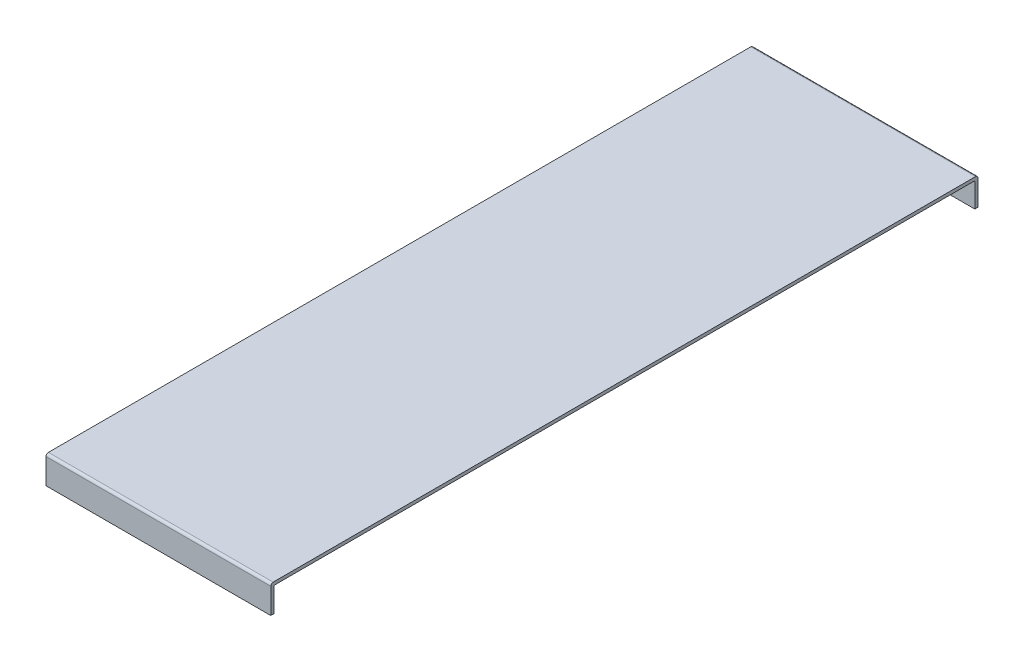
ISO-10303-21;
HEADER;
FILE_DESCRIPTION(('STEP AP214'),'2;1');
FILE_NAME('part.step','',(''),(''),'','','');
FILE_SCHEMA(('AUTOMOTIVE_DESIGN { 1 0 10303 214 1 1 1 1 }'));
ENDSEC;
DATA;
#1=APPLICATION_CONTEXT('core data for automotive mechanical design processes');
#2=APPLICATION_PROTOCOL_DEFINITION('international standard','automotive_design',2000,#1);
#3=PRODUCT_CONTEXT('',#1,'mechanical');
#4=PRODUCT('Part','Part','',(#3));
#5=PRODUCT_RELATED_PRODUCT_CATEGORY('part','',(#4));
#6=PRODUCT_DEFINITION_FORMATION('','',#4);
#7=PRODUCT_DEFINITION_CONTEXT('part definition',#1,'design');
#8=PRODUCT_DEFINITION('design','',#6,#7);
#9=PRODUCT_DEFINITION_SHAPE('','',#8);
#10=(LENGTH_UNIT() NAMED_UNIT(*) SI_UNIT(.MILLI.,.METRE.));
#11=(NAMED_UNIT(*) PLANE_ANGLE_UNIT() SI_UNIT($,.RADIAN.));
#12=(NAMED_UNIT(*) SI_UNIT($,.STERADIAN.) SOLID_ANGLE_UNIT());
#13=UNCERTAINTY_MEASURE_WITH_UNIT(LENGTH_MEASURE(1.E-05),#10,'distance_accuracy_value','');
#14=(GEOMETRIC_REPRESENTATION_CONTEXT(3) GLOBAL_UNCERTAINTY_ASSIGNED_CONTEXT((#13)) GLOBAL_UNIT_ASSIGNED_CONTEXT((#10,
#11,#12)) REPRESENTATION_CONTEXT('',''));
#15=CARTESIAN_POINT('',(0.,0.,0.));
#16=DIRECTION('',(0.,0.,1.));
#17=DIRECTION('',(1.,0.,0.));
#18=AXIS2_PLACEMENT_3D('',#15,#16,#17);
#19=CARTESIAN_POINT('',(0.,0.,0.));
#20=DIRECTION('',(0.,1.,0.));
#21=DIRECTION('',(0.,0.,1.));
#22=AXIS2_PLACEMENT_3D('',#19,#20,#21);
#23=PLANE('',#22);
#24=DIRECTION('',(0.,0.,-1.));
#25=VECTOR('',#24,1.);
#26=CARTESIAN_POINT('',(-155.631193932285,0.,176.974297755663));
#27=LINE('',#26,#25);
#28=CARTESIAN_POINT('',(-155.631193932285,0.,174.474297755663));
#29=VERTEX_POINT('',#28);
#30=CARTESIAN_POINT('',(-155.631193932285,0.,-260.135702244337));
#31=VERTEX_POINT('',#30);
#32=EDGE_CURVE('E174',#29,#31,#27,.T.);
#33=ORIENTED_EDGE('',*,*,#32,.F.);
#34=DIRECTION('',(1.,0.,0.));
#35=VECTOR('',#34,1.);
#36=CARTESIAN_POINT('',(-295.331193932285,0.,174.474297755663));
#37=LINE('',#36,#35);
#38=CARTESIAN_POINT('',(-295.331193932285,0.,174.474297755663));
#39=VERTEX_POINT('',#38);
#40=EDGE_CURVE('E214',#29,#39,#37,.F.);
#41=ORIENTED_EDGE('',*,*,#40,.T.);
#42=DIRECTION('',(0.,0.,1.));
#43=VECTOR('',#42,1.);
#44=CARTESIAN_POINT('',(-295.331193932285,0.,176.974297755663));
#45=LINE('',#44,#43);
#46=CARTESIAN_POINT('',(-295.331193932285,0.,-260.135702244337));
#47=VERTEX_POINT('',#46);
#48=EDGE_CURVE('E179',#47,#39,#45,.T.);
#49=ORIENTED_EDGE('',*,*,#48,.F.);
#50=DIRECTION('',(-1.,0.,0.));
#51=VECTOR('',#50,1.);
#52=CARTESIAN_POINT('',(-155.631193932285,0.,-260.135702244337));
#53=LINE('',#52,#51);
#54=EDGE_CURVE('E212',#47,#31,#53,.F.);
#55=ORIENTED_EDGE('',*,*,#54,.T.);
#56=EDGE_LOOP('',(#33,#41,#49,#55));
#57=FACE_BOUND('',#56,.T.);
#58=ADVANCED_FACE('F38',(#57),#23,.F.);
#59=CARTESIAN_POINT('',(-155.631193932285,2.,176.974297755663));
#60=DIRECTION('',(-1.,0.,0.));
#61=DIRECTION('',(0.,0.,1.));
#62=AXIS2_PLACEMENT_3D('',#59,#60,#61);
#63=PLANE('',#62);
#64=DIRECTION('',(0.,0.,-1.));
#65=VECTOR('',#64,1.);
#66=CARTESIAN_POINT('',(-155.631193932285,2.,176.974297755663));
#67=LINE('',#66,#65);
#68=CARTESIAN_POINT('',(-155.631193932285,2.,175.474297755663));
#69=VERTEX_POINT('',#68);
#70=CARTESIAN_POINT('',(-155.631193932285,2.,-261.135702244337));
#71=VERTEX_POINT('',#70);
#72=EDGE_CURVE('E175',#69,#71,#67,.T.);
#73=ORIENTED_EDGE('',*,*,#72,.F.);
#74=CARTESIAN_POINT('',(-155.631193932285,0.5,175.474297755663));
#75=DIRECTION('',(-1.,0.,0.));
#76=DIRECTION('',(0.,0.,1.));
#77=AXIS2_PLACEMENT_3D('',#74,#75,#76);
#78=CIRCLE('',#77,1.5);
#79=CARTESIAN_POINT('',(-155.631193932285,0.5,176.974297755663));
#80=VERTEX_POINT('',#79);
#81=EDGE_CURVE('E200',#69,#80,#78,.F.);
#82=ORIENTED_EDGE('',*,*,#81,.T.);
#83=DIRECTION('',(0.,-1.,0.));
#84=VECTOR('',#83,1.);
#85=CARTESIAN_POINT('',(-155.631193932285,2.,176.974297755663));
#86=LINE('',#85,#84);
#87=CARTESIAN_POINT('',(-155.631193932285,-15.24,176.974297755663));
#88=VERTEX_POINT('',#87);
#89=EDGE_CURVE('E182',#80,#88,#86,.T.);
#90=ORIENTED_EDGE('',*,*,#89,.T.);
#91=DIRECTION('',(0.,0.,1.));
#92=VECTOR('',#91,1.);
#93=CARTESIAN_POINT('',(-155.631193932285,-15.24,176.974297755663));
#94=LINE('',#93,#92);
#95=CARTESIAN_POINT('',(-155.631193932285,-15.24,174.974297755663));
#96=VERTEX_POINT('',#95);
#97=EDGE_CURVE('E139',#96,#88,#94,.T.);
#98=ORIENTED_EDGE('',*,*,#97,.F.);
#99=DIRECTION('',(0.,1.,0.));
#100=VECTOR('',#99,1.);
#101=CARTESIAN_POINT('',(-155.631193932285,-15.24,174.974297755663));
#102=LINE('',#101,#100);
#103=CARTESIAN_POINT('',(-155.631193932285,-0.500000000000004,174.974297755663));
#104=VERTEX_POINT('',#103);
#105=EDGE_CURVE('E135',#96,#104,#102,.T.);
#106=ORIENTED_EDGE('',*,*,#105,.T.);
#107=CARTESIAN_POINT('',(-155.631193932285,-0.5,174.474297755663));
#108=DIRECTION('',(-1.,0.,0.));
#109=DIRECTION('',(0.,0.,1.));
#110=AXIS2_PLACEMENT_3D('',#107,#108,#109);
#111=CIRCLE('',#110,0.5);
#112=EDGE_CURVE('E218',#104,#29,#111,.T.);
#113=ORIENTED_EDGE('',*,*,#112,.T.);
#114=ORIENTED_EDGE('',*,*,#32,.T.);
#115=CARTESIAN_POINT('',(-155.631193932285,-0.5,-260.135702244337));
#116=DIRECTION('',(-1.,0.,0.));
#117=DIRECTION('',(0.,0.,1.));
#118=AXIS2_PLACEMENT_3D('',#115,#116,#117);
#119=CIRCLE('',#118,0.5);
#120=CARTESIAN_POINT('',(-155.631193932285,-0.500000000000004,-260.635702244337));
#121=VERTEX_POINT('',#120);
#122=EDGE_CURVE('E11',#31,#121,#119,.T.);
#123=ORIENTED_EDGE('',*,*,#122,.T.);
#124=DIRECTION('',(0.,1.,0.));
#125=VECTOR('',#124,1.);
#126=CARTESIAN_POINT('',(-155.631193932285,-15.24,-260.635702244337));
#127=LINE('',#126,#125);
#128=CARTESIAN_POINT('',(-155.631193932285,-15.24,-260.635702244337));
#129=VERTEX_POINT('',#128);
#130=EDGE_CURVE('E172',#129,#121,#127,.T.);
#131=ORIENTED_EDGE('',*,*,#130,.F.);
#132=DIRECTION('',(0.,0.,1.));
#133=VECTOR('',#132,1.);
#134=CARTESIAN_POINT('',(-155.631193932285,-15.24,-262.635702244337));
#135=LINE('',#134,#133);
#136=CARTESIAN_POINT('',(-155.631193932285,-15.24,-262.635702244337));
#137=VERTEX_POINT('',#136);
#138=EDGE_CURVE('E154',#137,#129,#135,.T.);
#139=ORIENTED_EDGE('',*,*,#138,.F.);
#140=DIRECTION('',(0.,-1.,0.));
#141=VECTOR('',#140,1.);
#142=CARTESIAN_POINT('',(-155.631193932285,2.,-262.635702244337));
#143=LINE('',#142,#141);
#144=CARTESIAN_POINT('',(-155.631193932285,0.5,-262.635702244337));
#145=VERTEX_POINT('',#144);
#146=EDGE_CURVE('E190',#145,#137,#143,.T.);
#147=ORIENTED_EDGE('',*,*,#146,.F.);
#148=CARTESIAN_POINT('',(-155.631193932285,0.5,-261.135702244337));
#149=DIRECTION('',(-1.,0.,0.));
#150=DIRECTION('',(0.,0.,1.));
#151=AXIS2_PLACEMENT_3D('',#148,#149,#150);
#152=CIRCLE('',#151,1.5);
#153=EDGE_CURVE('E198',#145,#71,#152,.F.);
#154=ORIENTED_EDGE('',*,*,#153,.T.);
#155=EDGE_LOOP('',(#73,#82,#90,#98,#106,#113,#114,#123,#131,#139,#147,#154));
#156=FACE_BOUND('',#155,.T.);
#157=ADVANCED_FACE('F230',(#156),#63,.F.);
#158=CARTESIAN_POINT('',(-155.631193932285,2.,-262.635702244337));
#159=DIRECTION('',(0.,0.,1.));
#160=DIRECTION('',(1.,0.,0.));
#161=AXIS2_PLACEMENT_3D('',#158,#159,#160);
#162=PLANE('',#161);
#163=DIRECTION('',(0.,-1.,0.));
#164=VECTOR('',#163,1.);
#165=CARTESIAN_POINT('',(-295.331193932285,2.,-262.635702244337));
#166=LINE('',#165,#164);
#167=CARTESIAN_POINT('',(-295.331193932285,0.5,-262.635702244337));
#168=VERTEX_POINT('',#167);
#169=CARTESIAN_POINT('',(-295.331193932285,-15.24,-262.635702244337));
#170=VERTEX_POINT('',#169);
#171=EDGE_CURVE('E188',#168,#170,#166,.T.);
#172=ORIENTED_EDGE('',*,*,#171,.F.);
#173=DIRECTION('',(-1.,0.,0.));
#174=VECTOR('',#173,1.);
#175=CARTESIAN_POINT('',(-155.631193932285,0.5,-262.635702244337));
#176=LINE('',#175,#174);
#177=EDGE_CURVE('E208',#168,#145,#176,.F.);
#178=ORIENTED_EDGE('',*,*,#177,.T.);
#179=ORIENTED_EDGE('',*,*,#146,.T.);
#180=DIRECTION('',(1.,0.,0.));
#181=VECTOR('',#180,1.);
#182=CARTESIAN_POINT('',(-155.631193932285,-15.24,-262.635702244337));
#183=LINE('',#182,#181);
#184=EDGE_CURVE('E166',#170,#137,#183,.T.);
#185=ORIENTED_EDGE('',*,*,#184,.F.);
#186=EDGE_LOOP('',(#172,#178,#179,#185));
#187=FACE_BOUND('',#186,.T.);
#188=ADVANCED_FACE('F238',(#187),#162,.F.);
#189=CARTESIAN_POINT('',(-295.331193932285,2.,176.974297755663));
#190=DIRECTION('',(1.,0.,0.));
#191=DIRECTION('',(0.,0.,-1.));
#192=AXIS2_PLACEMENT_3D('',#189,#190,#191);
#193=PLANE('',#192);
#194=DIRECTION('',(0.,-1.,0.));
#195=VECTOR('',#194,1.);
#196=CARTESIAN_POINT('',(-295.331193932285,2.,176.974297755663));
#197=LINE('',#196,#195);
#198=CARTESIAN_POINT('',(-295.331193932285,0.5,176.974297755663));
#199=VERTEX_POINT('',#198);
#200=CARTESIAN_POINT('',(-295.331193932285,-15.24,176.974297755663));
#201=VERTEX_POINT('',#200);
#202=EDGE_CURVE('E186',#199,#201,#197,.T.);
#203=ORIENTED_EDGE('',*,*,#202,.F.);
#204=CARTESIAN_POINT('',(-295.331193932285,0.5,175.474297755663));
#205=DIRECTION('',(1.,0.,0.));
#206=DIRECTION('',(0.,0.,-1.));
#207=AXIS2_PLACEMENT_3D('',#204,#205,#206);
#208=CIRCLE('',#207,1.5);
#209=CARTESIAN_POINT('',(-295.331193932285,2.,175.474297755663));
#210=VERTEX_POINT('',#209);
#211=EDGE_CURVE('E206',#199,#210,#208,.F.);
#212=ORIENTED_EDGE('',*,*,#211,.T.);
#213=DIRECTION('',(0.,0.,1.));
#214=VECTOR('',#213,1.);
#215=CARTESIAN_POINT('',(-295.331193932285,2.,176.974297755663));
#216=LINE('',#215,#214);
#217=CARTESIAN_POINT('',(-295.331193932285,2.,-261.135702244337));
#218=VERTEX_POINT('',#217);
#219=EDGE_CURVE('E178',#218,#210,#216,.T.);
#220=ORIENTED_EDGE('',*,*,#219,.F.);
#221=CARTESIAN_POINT('',(-295.331193932285,0.5,-261.135702244337));
#222=DIRECTION('',(1.,0.,0.));
#223=DIRECTION('',(0.,0.,-1.));
#224=AXIS2_PLACEMENT_3D('',#221,#222,#223);
#225=CIRCLE('',#224,1.5);
#226=EDGE_CURVE('E204',#218,#168,#225,.F.);
#227=ORIENTED_EDGE('',*,*,#226,.T.);
#228=ORIENTED_EDGE('',*,*,#171,.T.);
#229=DIRECTION('',(0.,0.,-1.));
#230=VECTOR('',#229,1.);
#231=CARTESIAN_POINT('',(-295.331193932285,-15.24,-262.635702244337));
#232=LINE('',#231,#230);
#233=CARTESIAN_POINT('',(-295.331193932285,-15.24,-260.635702244337));
#234=VERTEX_POINT('',#233);
#235=EDGE_CURVE('E163',#234,#170,#232,.T.);
#236=ORIENTED_EDGE('',*,*,#235,.F.);
#237=DIRECTION('',(0.,1.,0.));
#238=VECTOR('',#237,1.);
#239=CARTESIAN_POINT('',(-295.331193932285,-15.24,-260.635702244337));
#240=LINE('',#239,#238);
#241=CARTESIAN_POINT('',(-295.331193932285,-0.500000000000004,-260.635702244337));
#242=VERTEX_POINT('',#241);
#243=EDGE_CURVE('E169',#234,#242,#240,.T.);
#244=ORIENTED_EDGE('',*,*,#243,.T.);
#245=CARTESIAN_POINT('',(-295.331193932285,-0.5,-260.135702244337));
#246=DIRECTION('',(1.,0.,0.));
#247=DIRECTION('',(0.,0.,-1.));
#248=AXIS2_PLACEMENT_3D('',#245,#246,#247);
#249=CIRCLE('',#248,0.5);
#250=EDGE_CURVE('E46',#242,#47,#249,.T.);
#251=ORIENTED_EDGE('',*,*,#250,.T.);
#252=ORIENTED_EDGE('',*,*,#48,.T.);
#253=CARTESIAN_POINT('',(-295.331193932285,-0.5,174.474297755663));
#254=DIRECTION('',(1.,0.,0.));
#255=DIRECTION('',(0.,0.,-1.));
#256=AXIS2_PLACEMENT_3D('',#253,#254,#255);
#257=CIRCLE('',#256,0.5);
#258=CARTESIAN_POINT('',(-295.331193932285,-0.500000000000004,174.974297755663));
#259=VERTEX_POINT('',#258);
#260=EDGE_CURVE('E153',#39,#259,#257,.T.);
#261=ORIENTED_EDGE('',*,*,#260,.T.);
#262=DIRECTION('',(0.,1.,0.));
#263=VECTOR('',#262,1.);
#264=CARTESIAN_POINT('',(-295.331193932285,-15.24,174.974297755663));
#265=LINE('',#264,#263);
#266=CARTESIAN_POINT('',(-295.331193932285,-15.24,174.974297755663));
#267=VERTEX_POINT('',#266);
#268=EDGE_CURVE('E132',#267,#259,#265,.T.);
#269=ORIENTED_EDGE('',*,*,#268,.F.);
#270=DIRECTION('',(0.,0.,-1.));
#271=VECTOR('',#270,1.);
#272=CARTESIAN_POINT('',(-295.331193932285,-15.24,176.974297755663));
#273=LINE('',#272,#271);
#274=EDGE_CURVE('E140',#201,#267,#273,.T.);
#275=ORIENTED_EDGE('',*,*,#274,.F.);
#276=EDGE_LOOP('',(#203,#212,#220,#227,#228,#236,#244,#251,#252,#261,#269,#275));
#277=FACE_BOUND('',#276,.T.);
#278=ADVANCED_FACE('F150',(#277),#193,.F.);
#279=CARTESIAN_POINT('',(-155.631193932285,2.,176.974297755663));
#280=DIRECTION('',(0.,0.,-1.));
#281=DIRECTION('',(-1.,0.,0.));
#282=AXIS2_PLACEMENT_3D('',#279,#280,#281);
#283=PLANE('',#282);
#284=ORIENTED_EDGE('',*,*,#89,.F.);
#285=DIRECTION('',(1.,0.,0.));
#286=VECTOR('',#285,1.);
#287=CARTESIAN_POINT('',(-295.331193932285,0.5,176.974297755663));
#288=LINE('',#287,#286);
#289=EDGE_CURVE('E202',#80,#199,#288,.F.);
#290=ORIENTED_EDGE('',*,*,#289,.T.);
#291=ORIENTED_EDGE('',*,*,#202,.T.);
#292=DIRECTION('',(-1.,0.,0.));
#293=VECTOR('',#292,1.);
#294=CARTESIAN_POINT('',(-295.331193932285,-15.24,176.974297755663));
#295=LINE('',#294,#293);
#296=EDGE_CURVE('E146',#88,#201,#295,.T.);
#297=ORIENTED_EDGE('',*,*,#296,.F.);
#298=EDGE_LOOP('',(#284,#290,#291,#297));
#299=FACE_BOUND('',#298,.T.);
#300=ADVANCED_FACE('F253',(#299),#283,.F.);
#301=CARTESIAN_POINT('',(0.,2.,0.));
#302=DIRECTION('',(0.,1.,0.));
#303=DIRECTION('',(0.,0.,1.));
#304=AXIS2_PLACEMENT_3D('',#301,#302,#303);
#305=PLANE('',#304);
#306=ORIENTED_EDGE('',*,*,#219,.T.);
#307=DIRECTION('',(1.,0.,0.));
#308=VECTOR('',#307,1.);
#309=CARTESIAN_POINT('',(-155.631193932285,2.,175.474297755663));
#310=LINE('',#309,#308);
#311=EDGE_CURVE('E195',#210,#69,#310,.T.);
#312=ORIENTED_EDGE('',*,*,#311,.T.);
#313=ORIENTED_EDGE('',*,*,#72,.T.);
#314=DIRECTION('',(-1.,0.,0.));
#315=VECTOR('',#314,1.);
#316=CARTESIAN_POINT('',(-295.331193932285,2.,-261.135702244337));
#317=LINE('',#316,#315);
#318=EDGE_CURVE('E192',#71,#218,#317,.T.);
#319=ORIENTED_EDGE('',*,*,#318,.T.);
#320=EDGE_LOOP('',(#306,#312,#313,#319));
#321=FACE_BOUND('',#320,.T.);
#322=ADVANCED_FACE('F244',(#321),#305,.T.);
#323=CARTESIAN_POINT('',(-155.631193932285,-15.24,-260.635702244337));
#324=DIRECTION('',(0.,0.,-1.));
#325=DIRECTION('',(-1.,0.,0.));
#326=AXIS2_PLACEMENT_3D('',#323,#324,#325);
#327=PLANE('',#326);
#328=ORIENTED_EDGE('',*,*,#130,.T.);
#329=DIRECTION('',(-1.,0.,0.));
#330=VECTOR('',#329,1.);
#331=CARTESIAN_POINT('',(-295.331193932285,-0.5,-260.635702244337));
#332=LINE('',#331,#330);
#333=EDGE_CURVE('E216',#121,#242,#332,.T.);
#334=ORIENTED_EDGE('',*,*,#333,.T.);
#335=ORIENTED_EDGE('',*,*,#243,.F.);
#336=DIRECTION('',(-1.,0.,0.));
#337=VECTOR('',#336,1.);
#338=CARTESIAN_POINT('',(-155.631193932285,-15.24,-260.635702244337));
#339=LINE('',#338,#337);
#340=EDGE_CURVE('E157',#129,#234,#339,.T.);
#341=ORIENTED_EDGE('',*,*,#340,.F.);
#342=EDGE_LOOP('',(#328,#334,#335,#341));
#343=FACE_BOUND('',#342,.T.);
#344=ADVANCED_FACE('F227',(#343),#327,.F.);
#345=CARTESIAN_POINT('',(0.,-15.24,0.));
#346=DIRECTION('',(0.,-1.,0.));
#347=DIRECTION('',(0.,0.,-1.));
#348=AXIS2_PLACEMENT_3D('',#345,#346,#347);
#349=PLANE('',#348);
#350=ORIENTED_EDGE('',*,*,#138,.T.);
#351=ORIENTED_EDGE('',*,*,#340,.T.);
#352=ORIENTED_EDGE('',*,*,#235,.T.);
#353=ORIENTED_EDGE('',*,*,#184,.T.);
#354=EDGE_LOOP('',(#350,#351,#352,#353));
#355=FACE_BOUND('',#354,.T.);
#356=ADVANCED_FACE('F234',(#355),#349,.T.);
#357=CARTESIAN_POINT('',(-295.331193932285,-15.24,174.974297755663));
#358=DIRECTION('',(0.,0.,1.));
#359=DIRECTION('',(1.,0.,0.));
#360=AXIS2_PLACEMENT_3D('',#357,#358,#359);
#361=PLANE('',#360);
#362=ORIENTED_EDGE('',*,*,#268,.T.);
#363=DIRECTION('',(1.,0.,0.));
#364=VECTOR('',#363,1.);
#365=CARTESIAN_POINT('',(-155.631193932285,-0.5,174.974297755663));
#366=LINE('',#365,#364);
#367=EDGE_CURVE('E210',#259,#104,#366,.T.);
#368=ORIENTED_EDGE('',*,*,#367,.T.);
#369=ORIENTED_EDGE('',*,*,#105,.F.);
#370=DIRECTION('',(1.,0.,0.));
#371=VECTOR('',#370,1.);
#372=CARTESIAN_POINT('',(-295.331193932285,-15.24,174.974297755663));
#373=LINE('',#372,#371);
#374=EDGE_CURVE('E127',#267,#96,#373,.T.);
#375=ORIENTED_EDGE('',*,*,#374,.F.);
#376=EDGE_LOOP('',(#362,#368,#369,#375));
#377=FACE_BOUND('',#376,.T.);
#378=ADVANCED_FACE('F129',(#377),#361,.F.);
#379=CARTESIAN_POINT('',(0.,-15.24,0.));
#380=DIRECTION('',(0.,-1.,0.));
#381=DIRECTION('',(0.,0.,-1.));
#382=AXIS2_PLACEMENT_3D('',#379,#380,#381);
#383=PLANE('',#382);
#384=ORIENTED_EDGE('',*,*,#274,.T.);
#385=ORIENTED_EDGE('',*,*,#374,.T.);
#386=ORIENTED_EDGE('',*,*,#97,.T.);
#387=ORIENTED_EDGE('',*,*,#296,.T.);
#388=EDGE_LOOP('',(#384,#385,#386,#387));
#389=FACE_BOUND('',#388,.T.);
#390=ADVANCED_FACE('F144',(#389),#383,.T.);
#391=CARTESIAN_POINT('',(0.,0.5,175.474297755663));
#392=DIRECTION('',(-1.,0.,0.));
#393=DIRECTION('',(0.,0.,1.));
#394=AXIS2_PLACEMENT_3D('',#391,#392,#393);
#395=CYLINDRICAL_SURFACE('',#394,1.5);
#396=ORIENTED_EDGE('',*,*,#211,.F.);
#397=ORIENTED_EDGE('',*,*,#289,.F.);
#398=ORIENTED_EDGE('',*,*,#81,.F.);
#399=ORIENTED_EDGE('',*,*,#311,.F.);
#400=EDGE_LOOP('',(#396,#397,#398,#399));
#401=FACE_BOUND('',#400,.T.);
#402=ADVANCED_FACE('F249',(#401),#395,.T.);
#403=CARTESIAN_POINT('',(-1.03764806436408E-13,0.5,-261.135702244337));
#404=DIRECTION('',(1.,0.,0.));
#405=DIRECTION('',(0.,0.,-1.));
#406=AXIS2_PLACEMENT_3D('',#403,#404,#405);
#407=CYLINDRICAL_SURFACE('',#406,1.5);
#408=ORIENTED_EDGE('',*,*,#153,.F.);
#409=ORIENTED_EDGE('',*,*,#177,.F.);
#410=ORIENTED_EDGE('',*,*,#226,.F.);
#411=ORIENTED_EDGE('',*,*,#318,.F.);
#412=EDGE_LOOP('',(#408,#409,#410,#411));
#413=FACE_BOUND('',#412,.T.);
#414=ADVANCED_FACE('F241',(#413),#407,.T.);
#415=CARTESIAN_POINT('',(-295.331193932285,-0.5,174.474297755663));
#416=DIRECTION('',(-1.,0.,0.));
#417=DIRECTION('',(0.,0.,1.));
#418=AXIS2_PLACEMENT_3D('',#415,#416,#417);
#419=CYLINDRICAL_SURFACE('',#418,0.5);
#420=ORIENTED_EDGE('',*,*,#260,.F.);
#421=ORIENTED_EDGE('',*,*,#40,.F.);
#422=ORIENTED_EDGE('',*,*,#112,.F.);
#423=ORIENTED_EDGE('',*,*,#367,.F.);
#424=EDGE_LOOP('',(#420,#421,#422,#423));
#425=FACE_BOUND('',#424,.T.);
#426=ADVANCED_FACE('F256',(#425),#419,.F.);
#427=CARTESIAN_POINT('',(-155.631193932285,-0.5,-260.135702244337));
#428=DIRECTION('',(1.,0.,0.));
#429=DIRECTION('',(0.,0.,-1.));
#430=AXIS2_PLACEMENT_3D('',#427,#428,#429);
#431=CYLINDRICAL_SURFACE('',#430,0.5);
#432=ORIENTED_EDGE('',*,*,#122,.F.);
#433=ORIENTED_EDGE('',*,*,#54,.F.);
#434=ORIENTED_EDGE('',*,*,#250,.F.);
#435=ORIENTED_EDGE('',*,*,#333,.F.);
#436=EDGE_LOOP('',(#432,#433,#434,#435));
#437=FACE_BOUND('',#436,.T.);
#438=ADVANCED_FACE('F40',(#437),#431,.F.);
#439=CLOSED_SHELL('',(#58,#157,#188,#278,#300,#322,#344,#356,#378,#390,#402,#414,#426,#438));
#440=MANIFOLD_SOLID_BREP('B2',#439);
#441=ADVANCED_BREP_SHAPE_REPRESENTATION('',(#18,#440),#14);
#442=SHAPE_DEFINITION_REPRESENTATION(#9,#441);
ENDSEC;
END-ISO-10303-21;
